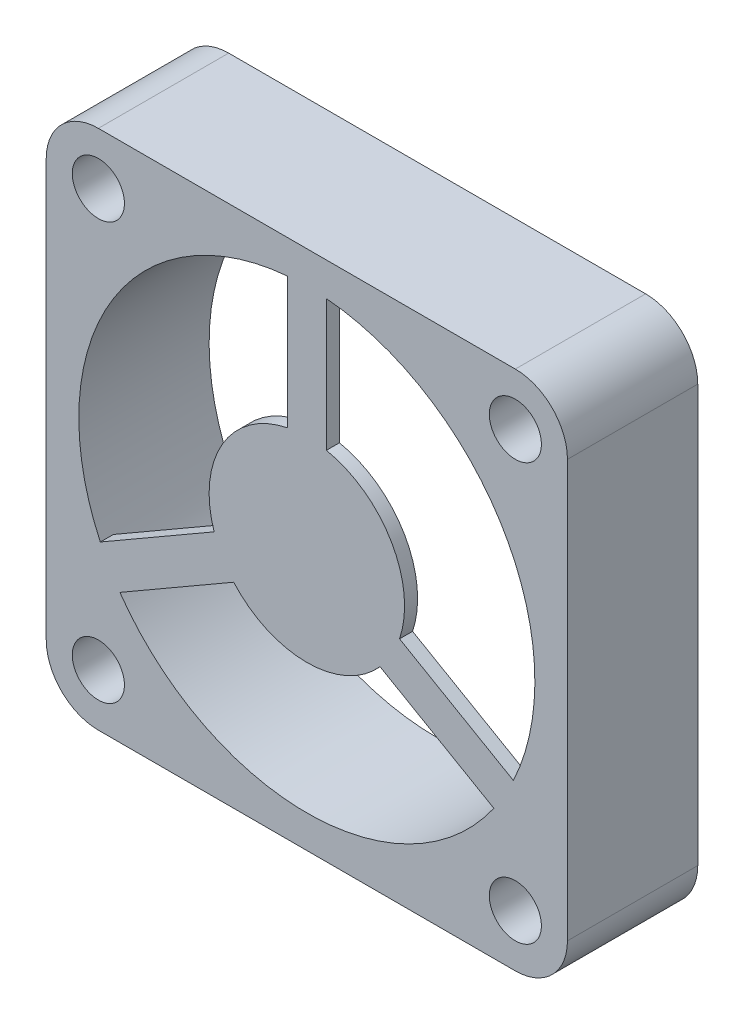
ISO-10303-21;
HEADER;
FILE_DESCRIPTION(('STEP AP214'),'2;1');
FILE_NAME('part.step','',(''),(''),'','','');
FILE_SCHEMA(('AUTOMOTIVE_DESIGN { 1 0 10303 214 1 1 1 1 }'));
ENDSEC;
DATA;
#1=APPLICATION_CONTEXT('core data for automotive mechanical design processes');
#2=APPLICATION_PROTOCOL_DEFINITION('international standard','automotive_design',2000,#1);
#3=PRODUCT_CONTEXT('',#1,'mechanical');
#4=PRODUCT('Part','Part','',(#3));
#5=PRODUCT_RELATED_PRODUCT_CATEGORY('part','',(#4));
#6=PRODUCT_DEFINITION_FORMATION('','',#4);
#7=PRODUCT_DEFINITION_CONTEXT('part definition',#1,'design');
#8=PRODUCT_DEFINITION('design','',#6,#7);
#9=PRODUCT_DEFINITION_SHAPE('','',#8);
#10=(LENGTH_UNIT() NAMED_UNIT(*) SI_UNIT(.MILLI.,.METRE.));
#11=(NAMED_UNIT(*) PLANE_ANGLE_UNIT() SI_UNIT($,.RADIAN.));
#12=(NAMED_UNIT(*) SI_UNIT($,.STERADIAN.) SOLID_ANGLE_UNIT());
#13=UNCERTAINTY_MEASURE_WITH_UNIT(LENGTH_MEASURE(1.E-05),#10,'distance_accuracy_value','');
#14=(GEOMETRIC_REPRESENTATION_CONTEXT(3) GLOBAL_UNCERTAINTY_ASSIGNED_CONTEXT((#13)) GLOBAL_UNIT_ASSIGNED_CONTEXT((#10,
#11,#12)) REPRESENTATION_CONTEXT('',''));
#15=CARTESIAN_POINT('',(0.,0.,0.));
#16=DIRECTION('',(0.,0.,1.));
#17=DIRECTION('',(1.,0.,0.));
#18=AXIS2_PLACEMENT_3D('',#15,#16,#17);
#19=CARTESIAN_POINT('',(-16.,-16.,10.));
#20=DIRECTION('',(0.,0.,-1.));
#21=DIRECTION('',(-1.,0.,0.));
#22=AXIS2_PLACEMENT_3D('',#19,#20,#21);
#23=PLANE('',#22);
#24=CARTESIAN_POINT('',(0.,0.,10.));
#25=DIRECTION('',(0.,0.,1.));
#26=DIRECTION('',(1.,0.,0.));
#27=AXIS2_PLACEMENT_3D('',#24,#25,#26);
#28=CIRCLE('',#27,17.5);
#29=CARTESIAN_POINT('',(-1.5,17.4355957741627,10.));
#30=VERTEX_POINT('',#29);
#31=CARTESIAN_POINT('',(-15.8496688705415,-7.41875978140468,10.));
#32=VERTEX_POINT('',#31);
#33=EDGE_CURVE('E295',#30,#32,#28,.T.);
#34=ORIENTED_EDGE('',*,*,#33,.F.);
#35=DIRECTION('',(0.,-1.,0.));
#36=VECTOR('',#35,1.);
#37=CARTESIAN_POINT('',(-1.5,17.4355957741627,10.));
#38=LINE('',#37,#36);
#39=CARTESIAN_POINT('',(-1.5,7.34846922834953,10.));
#40=VERTEX_POINT('',#39);
#41=EDGE_CURVE('E221',#30,#40,#38,.T.);
#42=ORIENTED_EDGE('',*,*,#41,.T.);
#43=CARTESIAN_POINT('',(0.,0.,10.));
#44=DIRECTION('',(0.,0.,1.));
#45=DIRECTION('',(1.,0.,0.));
#46=AXIS2_PLACEMENT_3D('',#43,#44,#45);
#47=CIRCLE('',#46,7.50000000000002);
#48=CARTESIAN_POINT('',(-7.11396103067895,-2.37519650849812,10.));
#49=VERTEX_POINT('',#48);
#50=EDGE_CURVE('E176',#40,#49,#47,.T.);
#51=ORIENTED_EDGE('',*,*,#50,.T.);
#52=DIRECTION('',(-0.866025403784439,-0.5,0.));
#53=VECTOR('',#52,1.);
#54=CARTESIAN_POINT('',(-7.11396103067897,-2.37519650849813,10.));
#55=LINE('',#54,#53);
#56=EDGE_CURVE('E224',#49,#32,#55,.T.);
#57=ORIENTED_EDGE('',*,*,#56,.T.);
#58=EDGE_LOOP('',(#34,#42,#51,#57));
#59=FACE_BOUND('',#58,.T.);
#60=CARTESIAN_POINT('',(15.8496688705415,-7.41875978140472,10.));
#61=VERTEX_POINT('',#60);
#62=CARTESIAN_POINT('',(1.5,17.4355957741627,10.));
#63=VERTEX_POINT('',#62);
#64=EDGE_CURVE('E292',#61,#63,#28,.T.);
#65=ORIENTED_EDGE('',*,*,#64,.F.);
#66=DIRECTION('',(-0.866025403784439,0.499999999999999,0.));
#67=VECTOR('',#66,1.);
#68=CARTESIAN_POINT('',(15.8496688705415,-7.41875978140473,10.));
#69=LINE('',#68,#67);
#70=CARTESIAN_POINT('',(7.11396103067892,-2.37519650849815,10.));
#71=VERTEX_POINT('',#70);
#72=EDGE_CURVE('E236',#61,#71,#69,.T.);
#73=ORIENTED_EDGE('',*,*,#72,.T.);
#74=CARTESIAN_POINT('',(0.,0.,10.));
#75=DIRECTION('',(0.,0.,1.));
#76=DIRECTION('',(1.,0.,0.));
#77=AXIS2_PLACEMENT_3D('',#74,#75,#76);
#78=CIRCLE('',#77,7.5);
#79=CARTESIAN_POINT('',(1.5,7.34846922834954,10.));
#80=VERTEX_POINT('',#79);
#81=EDGE_CURVE('E239',#71,#80,#78,.T.);
#82=ORIENTED_EDGE('',*,*,#81,.T.);
#83=DIRECTION('',(0.,1.,0.));
#84=VECTOR('',#83,1.);
#85=CARTESIAN_POINT('',(1.5,7.34846922834953,10.));
#86=LINE('',#85,#84);
#87=EDGE_CURVE('E195',#80,#63,#86,.T.);
#88=ORIENTED_EDGE('',*,*,#87,.T.);
#89=EDGE_LOOP('',(#65,#73,#82,#88));
#90=FACE_BOUND('',#89,.T.);
#91=CARTESIAN_POINT('',(-16.,-16.,10.));
#92=DIRECTION('',(0.,0.,1.));
#93=DIRECTION('',(-1.,0.,0.));
#94=AXIS2_PLACEMENT_3D('',#91,#92,#93);
#95=CIRCLE('',#94,4.);
#96=CARTESIAN_POINT('',(-20.,-16.,10.));
#97=VERTEX_POINT('',#96);
#98=CARTESIAN_POINT('',(-16.,-20.,10.));
#99=VERTEX_POINT('',#98);
#100=EDGE_CURVE('E298',#97,#99,#95,.T.);
#101=ORIENTED_EDGE('',*,*,#100,.T.);
#102=DIRECTION('',(1.,0.,0.));
#103=VECTOR('',#102,1.);
#104=CARTESIAN_POINT('',(-16.,-20.,10.));
#105=LINE('',#104,#103);
#106=CARTESIAN_POINT('',(16.,-20.,10.));
#107=VERTEX_POINT('',#106);
#108=EDGE_CURVE('E301',#99,#107,#105,.T.);
#109=ORIENTED_EDGE('',*,*,#108,.T.);
#110=CARTESIAN_POINT('',(16.,-16.,10.));
#111=DIRECTION('',(0.,0.,1.));
#112=DIRECTION('',(1.,0.,0.));
#113=AXIS2_PLACEMENT_3D('',#110,#111,#112);
#114=CIRCLE('',#113,4.);
#115=CARTESIAN_POINT('',(20.,-16.,10.));
#116=VERTEX_POINT('',#115);
#117=EDGE_CURVE('E304',#107,#116,#114,.T.);
#118=ORIENTED_EDGE('',*,*,#117,.T.);
#119=DIRECTION('',(0.,1.,0.));
#120=VECTOR('',#119,1.);
#121=CARTESIAN_POINT('',(20.,-16.,10.));
#122=LINE('',#121,#120);
#123=CARTESIAN_POINT('',(20.,16.,10.));
#124=VERTEX_POINT('',#123);
#125=EDGE_CURVE('E306',#116,#124,#122,.T.);
#126=ORIENTED_EDGE('',*,*,#125,.T.);
#127=CARTESIAN_POINT('',(16.,16.,10.));
#128=DIRECTION('',(0.,0.,1.));
#129=DIRECTION('',(-1.,0.,0.));
#130=AXIS2_PLACEMENT_3D('',#127,#128,#129);
#131=CIRCLE('',#130,4.);
#132=CARTESIAN_POINT('',(16.,20.,10.));
#133=VERTEX_POINT('',#132);
#134=EDGE_CURVE('E308',#124,#133,#131,.T.);
#135=ORIENTED_EDGE('',*,*,#134,.T.);
#136=DIRECTION('',(-1.,0.,0.));
#137=VECTOR('',#136,1.);
#138=CARTESIAN_POINT('',(-16.,20.,10.));
#139=LINE('',#138,#137);
#140=CARTESIAN_POINT('',(-16.,20.,10.));
#141=VERTEX_POINT('',#140);
#142=EDGE_CURVE('E310',#133,#141,#139,.T.);
#143=ORIENTED_EDGE('',*,*,#142,.T.);
#144=CARTESIAN_POINT('',(-16.,16.,10.));
#145=DIRECTION('',(0.,0.,1.));
#146=DIRECTION('',(-1.,0.,0.));
#147=AXIS2_PLACEMENT_3D('',#144,#145,#146);
#148=CIRCLE('',#147,4.);
#149=CARTESIAN_POINT('',(-20.,16.,10.));
#150=VERTEX_POINT('',#149);
#151=EDGE_CURVE('E312',#141,#150,#148,.T.);
#152=ORIENTED_EDGE('',*,*,#151,.T.);
#153=DIRECTION('',(0.,-1.,0.));
#154=VECTOR('',#153,1.);
#155=CARTESIAN_POINT('',(-20.,-16.,10.));
#156=LINE('',#155,#154);
#157=EDGE_CURVE('E314',#150,#97,#156,.T.);
#158=ORIENTED_EDGE('',*,*,#157,.T.);
#159=EDGE_LOOP('',(#101,#109,#118,#126,#135,#143,#152,#158));
#160=FACE_BOUND('',#159,.T.);
#161=DIRECTION('',(0.866025403784439,-0.5,0.));
#162=VECTOR('',#161,1.);
#163=CARTESIAN_POINT('',(5.61396103067892,-4.97327271985147,10.));
#164=LINE('',#163,#162);
#165=CARTESIAN_POINT('',(5.61396103067892,-4.97327271985147,10.));
#166=VERTEX_POINT('',#165);
#167=CARTESIAN_POINT('',(14.3496688705415,-10.016835992758,10.));
#168=VERTEX_POINT('',#167);
#169=EDGE_CURVE('E233',#166,#168,#164,.T.);
#170=ORIENTED_EDGE('',*,*,#169,.T.);
#171=CARTESIAN_POINT('',(-14.3496688705415,-10.016835992758,10.));
#172=VERTEX_POINT('',#171);
#173=EDGE_CURVE('E294',#172,#168,#28,.T.);
#174=ORIENTED_EDGE('',*,*,#173,.F.);
#175=DIRECTION('',(0.866025403784438,0.5,0.));
#176=VECTOR('',#175,1.);
#177=CARTESIAN_POINT('',(-14.3496688705415,-10.016835992758,10.));
#178=LINE('',#177,#176);
#179=CARTESIAN_POINT('',(-5.61396103067897,-4.97327271985144,10.));
#180=VERTEX_POINT('',#179);
#181=EDGE_CURVE('E227',#172,#180,#178,.T.);
#182=ORIENTED_EDGE('',*,*,#181,.T.);
#183=CARTESIAN_POINT('',(0.,0.,10.));
#184=DIRECTION('',(0.,0.,1.));
#185=DIRECTION('',(1.,0.,0.));
#186=AXIS2_PLACEMENT_3D('',#183,#184,#185);
#187=CIRCLE('',#186,7.50000000000003);
#188=EDGE_CURVE('E230',#180,#166,#187,.T.);
#189=ORIENTED_EDGE('',*,*,#188,.T.);
#190=EDGE_LOOP('',(#170,#174,#182,#189));
#191=FACE_BOUND('',#190,.T.);
#192=CARTESIAN_POINT('',(-16.,16.,10.));
#193=DIRECTION('',(0.,0.,1.));
#194=DIRECTION('',(1.,0.,0.));
#195=AXIS2_PLACEMENT_3D('',#192,#193,#194);
#196=CIRCLE('',#195,2.);
#197=CARTESIAN_POINT('',(-14.,16.,10.));
#198=VERTEX_POINT('',#197);
#199=EDGE_CURVE('E286',#198,#198,#196,.T.);
#200=ORIENTED_EDGE('',*,*,#199,.F.);
#201=EDGE_LOOP('',(#200));
#202=FACE_BOUND('',#201,.T.);
#203=CARTESIAN_POINT('',(16.,16.,10.));
#204=DIRECTION('',(0.,0.,1.));
#205=DIRECTION('',(1.,0.,0.));
#206=AXIS2_PLACEMENT_3D('',#203,#204,#205);
#207=CIRCLE('',#206,2.);
#208=CARTESIAN_POINT('',(18.,16.,10.));
#209=VERTEX_POINT('',#208);
#210=EDGE_CURVE('E280',#209,#209,#207,.T.);
#211=ORIENTED_EDGE('',*,*,#210,.F.);
#212=EDGE_LOOP('',(#211));
#213=FACE_BOUND('',#212,.T.);
#214=CARTESIAN_POINT('',(16.,-16.,10.));
#215=DIRECTION('',(0.,0.,1.));
#216=DIRECTION('',(1.,0.,0.));
#217=AXIS2_PLACEMENT_3D('',#214,#215,#216);
#218=CIRCLE('',#217,2.);
#219=CARTESIAN_POINT('',(18.,-16.,10.));
#220=VERTEX_POINT('',#219);
#221=EDGE_CURVE('E274',#220,#220,#218,.T.);
#222=ORIENTED_EDGE('',*,*,#221,.F.);
#223=EDGE_LOOP('',(#222));
#224=FACE_BOUND('',#223,.T.);
#225=CARTESIAN_POINT('',(-16.,-16.,10.));
#226=DIRECTION('',(0.,0.,1.));
#227=DIRECTION('',(1.,0.,0.));
#228=AXIS2_PLACEMENT_3D('',#225,#226,#227);
#229=CIRCLE('',#228,2.);
#230=CARTESIAN_POINT('',(-14.,-16.,10.));
#231=VERTEX_POINT('',#230);
#232=EDGE_CURVE('E268',#231,#231,#229,.T.);
#233=ORIENTED_EDGE('',*,*,#232,.F.);
#234=EDGE_LOOP('',(#233));
#235=FACE_BOUND('',#234,.T.);
#236=ADVANCED_FACE('F35',(#59,#90,#160,#191,#202,#213,#224,#235),#23,.F.);
#237=CARTESIAN_POINT('',(-16.,-16.,0.));
#238=DIRECTION('',(0.,0.,-1.));
#239=DIRECTION('',(-1.,0.,0.));
#240=AXIS2_PLACEMENT_3D('',#237,#238,#239);
#241=PLANE('',#240);
#242=CARTESIAN_POINT('',(16.,-16.,0.));
#243=DIRECTION('',(0.,0.,1.));
#244=DIRECTION('',(1.,0.,0.));
#245=AXIS2_PLACEMENT_3D('',#242,#243,#244);
#246=CIRCLE('',#245,2.);
#247=CARTESIAN_POINT('',(18.,-16.,0.));
#248=VERTEX_POINT('',#247);
#249=EDGE_CURVE('E271',#248,#248,#246,.T.);
#250=ORIENTED_EDGE('',*,*,#249,.T.);
#251=EDGE_LOOP('',(#250));
#252=FACE_BOUND('',#251,.T.);
#253=CARTESIAN_POINT('',(-16.,16.,0.));
#254=DIRECTION('',(0.,0.,1.));
#255=DIRECTION('',(1.,0.,0.));
#256=AXIS2_PLACEMENT_3D('',#253,#254,#255);
#257=CIRCLE('',#256,2.);
#258=CARTESIAN_POINT('',(-14.,16.,0.));
#259=VERTEX_POINT('',#258);
#260=EDGE_CURVE('E283',#259,#259,#257,.T.);
#261=ORIENTED_EDGE('',*,*,#260,.T.);
#262=EDGE_LOOP('',(#261));
#263=FACE_BOUND('',#262,.T.);
#264=CARTESIAN_POINT('',(-16.,-16.,0.));
#265=DIRECTION('',(0.,0.,1.));
#266=DIRECTION('',(-1.,0.,0.));
#267=AXIS2_PLACEMENT_3D('',#264,#265,#266);
#268=CIRCLE('',#267,4.);
#269=CARTESIAN_POINT('',(-20.,-16.,0.));
#270=VERTEX_POINT('',#269);
#271=CARTESIAN_POINT('',(-16.,-20.,0.));
#272=VERTEX_POINT('',#271);
#273=EDGE_CURVE('E317',#270,#272,#268,.T.);
#274=ORIENTED_EDGE('',*,*,#273,.F.);
#275=DIRECTION('',(0.,-1.,0.));
#276=VECTOR('',#275,1.);
#277=CARTESIAN_POINT('',(-20.,-16.,0.));
#278=LINE('',#277,#276);
#279=CARTESIAN_POINT('',(-20.,16.,0.));
#280=VERTEX_POINT('',#279);
#281=EDGE_CURVE('E302',#280,#270,#278,.T.);
#282=ORIENTED_EDGE('',*,*,#281,.F.);
#283=CARTESIAN_POINT('',(-16.,16.,0.));
#284=DIRECTION('',(0.,0.,1.));
#285=DIRECTION('',(-1.,0.,0.));
#286=AXIS2_PLACEMENT_3D('',#283,#284,#285);
#287=CIRCLE('',#286,4.);
#288=CARTESIAN_POINT('',(-16.,20.,0.));
#289=VERTEX_POINT('',#288);
#290=EDGE_CURVE('E330',#289,#280,#287,.T.);
#291=ORIENTED_EDGE('',*,*,#290,.F.);
#292=DIRECTION('',(-1.,0.,0.));
#293=VECTOR('',#292,1.);
#294=CARTESIAN_POINT('',(-16.,20.,0.));
#295=LINE('',#294,#293);
#296=CARTESIAN_POINT('',(16.,20.,0.));
#297=VERTEX_POINT('',#296);
#298=EDGE_CURVE('E328',#297,#289,#295,.T.);
#299=ORIENTED_EDGE('',*,*,#298,.F.);
#300=CARTESIAN_POINT('',(16.,16.,0.));
#301=DIRECTION('',(0.,0.,1.));
#302=DIRECTION('',(-1.,0.,0.));
#303=AXIS2_PLACEMENT_3D('',#300,#301,#302);
#304=CIRCLE('',#303,4.);
#305=CARTESIAN_POINT('',(20.,16.,0.));
#306=VERTEX_POINT('',#305);
#307=EDGE_CURVE('E326',#306,#297,#304,.T.);
#308=ORIENTED_EDGE('',*,*,#307,.F.);
#309=DIRECTION('',(0.,1.,0.));
#310=VECTOR('',#309,1.);
#311=CARTESIAN_POINT('',(20.,-16.,0.));
#312=LINE('',#311,#310);
#313=CARTESIAN_POINT('',(20.,-16.,0.));
#314=VERTEX_POINT('',#313);
#315=EDGE_CURVE('E324',#314,#306,#312,.T.);
#316=ORIENTED_EDGE('',*,*,#315,.F.);
#317=CARTESIAN_POINT('',(16.,-16.,0.));
#318=DIRECTION('',(0.,0.,1.));
#319=DIRECTION('',(1.,0.,0.));
#320=AXIS2_PLACEMENT_3D('',#317,#318,#319);
#321=CIRCLE('',#320,4.);
#322=CARTESIAN_POINT('',(16.,-20.,0.));
#323=VERTEX_POINT('',#322);
#324=EDGE_CURVE('E322',#323,#314,#321,.T.);
#325=ORIENTED_EDGE('',*,*,#324,.F.);
#326=DIRECTION('',(1.,0.,0.));
#327=VECTOR('',#326,1.);
#328=CARTESIAN_POINT('',(-16.,-20.,0.));
#329=LINE('',#328,#327);
#330=EDGE_CURVE('E320',#272,#323,#329,.T.);
#331=ORIENTED_EDGE('',*,*,#330,.F.);
#332=EDGE_LOOP('',(#274,#282,#291,#299,#308,#316,#325,#331));
#333=FACE_BOUND('',#332,.T.);
#334=CARTESIAN_POINT('',(0.,0.,0.));
#335=DIRECTION('',(0.,0.,1.));
#336=DIRECTION('',(1.,0.,0.));
#337=AXIS2_PLACEMENT_3D('',#334,#335,#336);
#338=CIRCLE('',#337,17.5);
#339=CARTESIAN_POINT('',(17.5,0.,0.));
#340=VERTEX_POINT('',#339);
#341=EDGE_CURVE('E289',#340,#340,#338,.T.);
#342=ORIENTED_EDGE('',*,*,#341,.T.);
#343=EDGE_LOOP('',(#342));
#344=FACE_BOUND('',#343,.T.);
#345=CARTESIAN_POINT('',(16.,16.,0.));
#346=DIRECTION('',(0.,0.,1.));
#347=DIRECTION('',(1.,0.,0.));
#348=AXIS2_PLACEMENT_3D('',#345,#346,#347);
#349=CIRCLE('',#348,2.);
#350=CARTESIAN_POINT('',(18.,16.,0.));
#351=VERTEX_POINT('',#350);
#352=EDGE_CURVE('E277',#351,#351,#349,.T.);
#353=ORIENTED_EDGE('',*,*,#352,.T.);
#354=EDGE_LOOP('',(#353));
#355=FACE_BOUND('',#354,.T.);
#356=CARTESIAN_POINT('',(-16.,-16.,0.));
#357=DIRECTION('',(0.,0.,1.));
#358=DIRECTION('',(1.,0.,0.));
#359=AXIS2_PLACEMENT_3D('',#356,#357,#358);
#360=CIRCLE('',#359,2.);
#361=CARTESIAN_POINT('',(-14.,-16.,0.));
#362=VERTEX_POINT('',#361);
#363=EDGE_CURVE('E245',#362,#362,#360,.T.);
#364=ORIENTED_EDGE('',*,*,#363,.T.);
#365=EDGE_LOOP('',(#364));
#366=FACE_BOUND('',#365,.T.);
#367=ADVANCED_FACE('F360',(#252,#263,#333,#344,#355,#366),#241,.T.);
#368=CARTESIAN_POINT('',(-16.,-16.,10.));
#369=DIRECTION('',(0.,0.,-1.));
#370=DIRECTION('',(-1.,0.,0.));
#371=AXIS2_PLACEMENT_3D('',#368,#369,#370);
#372=CYLINDRICAL_SURFACE('',#371,4.);
#373=ORIENTED_EDGE('',*,*,#273,.T.);
#374=DIRECTION('',(0.,0.,-1.));
#375=VECTOR('',#374,1.);
#376=CARTESIAN_POINT('',(-16.,-20.,10.));
#377=LINE('',#376,#375);
#378=EDGE_CURVE('E11',#99,#272,#377,.T.);
#379=ORIENTED_EDGE('',*,*,#378,.F.);
#380=ORIENTED_EDGE('',*,*,#100,.F.);
#381=DIRECTION('',(0.,0.,-1.));
#382=VECTOR('',#381,1.);
#383=CARTESIAN_POINT('',(-20.,-16.,10.));
#384=LINE('',#383,#382);
#385=EDGE_CURVE('E316',#97,#270,#384,.T.);
#386=ORIENTED_EDGE('',*,*,#385,.T.);
#387=EDGE_LOOP('',(#373,#379,#380,#386));
#388=FACE_BOUND('',#387,.T.);
#389=ADVANCED_FACE('F37',(#388),#372,.T.);
#390=CARTESIAN_POINT('',(-16.,-20.,10.));
#391=DIRECTION('',(0.,1.,0.));
#392=DIRECTION('',(0.,0.,1.));
#393=AXIS2_PLACEMENT_3D('',#390,#391,#392);
#394=PLANE('',#393);
#395=ORIENTED_EDGE('',*,*,#330,.T.);
#396=DIRECTION('',(0.,0.,-1.));
#397=VECTOR('',#396,1.);
#398=CARTESIAN_POINT('',(16.,-20.,10.));
#399=LINE('',#398,#397);
#400=EDGE_CURVE('E43',#107,#323,#399,.T.);
#401=ORIENTED_EDGE('',*,*,#400,.F.);
#402=ORIENTED_EDGE('',*,*,#108,.F.);
#403=ORIENTED_EDGE('',*,*,#378,.T.);
#404=EDGE_LOOP('',(#395,#401,#402,#403));
#405=FACE_BOUND('',#404,.T.);
#406=ADVANCED_FACE('F378',(#405),#394,.F.);
#407=CARTESIAN_POINT('',(16.,-16.,10.));
#408=DIRECTION('',(0.,0.,-1.));
#409=DIRECTION('',(-1.,0.,0.));
#410=AXIS2_PLACEMENT_3D('',#407,#408,#409);
#411=CYLINDRICAL_SURFACE('',#410,4.);
#412=ORIENTED_EDGE('',*,*,#324,.T.);
#413=DIRECTION('',(0.,0.,-1.));
#414=VECTOR('',#413,1.);
#415=CARTESIAN_POINT('',(20.,-16.,10.));
#416=LINE('',#415,#414);
#417=EDGE_CURVE('E347',#116,#314,#416,.T.);
#418=ORIENTED_EDGE('',*,*,#417,.F.);
#419=ORIENTED_EDGE('',*,*,#117,.F.);
#420=ORIENTED_EDGE('',*,*,#400,.T.);
#421=EDGE_LOOP('',(#412,#418,#419,#420));
#422=FACE_BOUND('',#421,.T.);
#423=ADVANCED_FACE('F354',(#422),#411,.T.);
#424=CARTESIAN_POINT('',(20.,-16.,10.));
#425=DIRECTION('',(-1.,0.,0.));
#426=DIRECTION('',(0.,0.,1.));
#427=AXIS2_PLACEMENT_3D('',#424,#425,#426);
#428=PLANE('',#427);
#429=ORIENTED_EDGE('',*,*,#315,.T.);
#430=DIRECTION('',(0.,0.,-1.));
#431=VECTOR('',#430,1.);
#432=CARTESIAN_POINT('',(20.,16.,10.));
#433=LINE('',#432,#431);
#434=EDGE_CURVE('E344',#124,#306,#433,.T.);
#435=ORIENTED_EDGE('',*,*,#434,.F.);
#436=ORIENTED_EDGE('',*,*,#125,.F.);
#437=ORIENTED_EDGE('',*,*,#417,.T.);
#438=EDGE_LOOP('',(#429,#435,#436,#437));
#439=FACE_BOUND('',#438,.T.);
#440=ADVANCED_FACE('F366',(#439),#428,.F.);
#441=CARTESIAN_POINT('',(16.,16.,10.));
#442=DIRECTION('',(0.,0.,-1.));
#443=DIRECTION('',(-1.,0.,0.));
#444=AXIS2_PLACEMENT_3D('',#441,#442,#443);
#445=CYLINDRICAL_SURFACE('',#444,4.);
#446=ORIENTED_EDGE('',*,*,#307,.T.);
#447=DIRECTION('',(0.,0.,-1.));
#448=VECTOR('',#447,1.);
#449=CARTESIAN_POINT('',(16.,20.,10.));
#450=LINE('',#449,#448);
#451=EDGE_CURVE('E341',#133,#297,#450,.T.);
#452=ORIENTED_EDGE('',*,*,#451,.F.);
#453=ORIENTED_EDGE('',*,*,#134,.F.);
#454=ORIENTED_EDGE('',*,*,#434,.T.);
#455=EDGE_LOOP('',(#446,#452,#453,#454));
#456=FACE_BOUND('',#455,.T.);
#457=ADVANCED_FACE('F370',(#456),#445,.T.);
#458=CARTESIAN_POINT('',(-16.,20.,10.));
#459=DIRECTION('',(0.,-1.,0.));
#460=DIRECTION('',(0.,0.,-1.));
#461=AXIS2_PLACEMENT_3D('',#458,#459,#460);
#462=PLANE('',#461);
#463=ORIENTED_EDGE('',*,*,#298,.T.);
#464=DIRECTION('',(0.,0.,-1.));
#465=VECTOR('',#464,1.);
#466=CARTESIAN_POINT('',(-16.,20.,10.));
#467=LINE('',#466,#465);
#468=EDGE_CURVE('E338',#141,#289,#467,.T.);
#469=ORIENTED_EDGE('',*,*,#468,.F.);
#470=ORIENTED_EDGE('',*,*,#142,.F.);
#471=ORIENTED_EDGE('',*,*,#451,.T.);
#472=EDGE_LOOP('',(#463,#469,#470,#471));
#473=FACE_BOUND('',#472,.T.);
#474=ADVANCED_FACE('F391',(#473),#462,.F.);
#475=CARTESIAN_POINT('',(-16.,16.,10.));
#476=DIRECTION('',(0.,0.,-1.));
#477=DIRECTION('',(-1.,0.,0.));
#478=AXIS2_PLACEMENT_3D('',#475,#476,#477);
#479=CYLINDRICAL_SURFACE('',#478,4.);
#480=ORIENTED_EDGE('',*,*,#290,.T.);
#481=DIRECTION('',(0.,0.,-1.));
#482=VECTOR('',#481,1.);
#483=CARTESIAN_POINT('',(-20.,16.,10.));
#484=LINE('',#483,#482);
#485=EDGE_CURVE('E335',#150,#280,#484,.T.);
#486=ORIENTED_EDGE('',*,*,#485,.F.);
#487=ORIENTED_EDGE('',*,*,#151,.F.);
#488=ORIENTED_EDGE('',*,*,#468,.T.);
#489=EDGE_LOOP('',(#480,#486,#487,#488));
#490=FACE_BOUND('',#489,.T.);
#491=ADVANCED_FACE('F389',(#490),#479,.T.);
#492=CARTESIAN_POINT('',(-20.,-16.,10.));
#493=DIRECTION('',(1.,0.,0.));
#494=DIRECTION('',(0.,0.,-1.));
#495=AXIS2_PLACEMENT_3D('',#492,#493,#494);
#496=PLANE('',#495);
#497=ORIENTED_EDGE('',*,*,#281,.T.);
#498=ORIENTED_EDGE('',*,*,#385,.F.);
#499=ORIENTED_EDGE('',*,*,#157,.F.);
#500=ORIENTED_EDGE('',*,*,#485,.T.);
#501=EDGE_LOOP('',(#497,#498,#499,#500));
#502=FACE_BOUND('',#501,.T.);
#503=ADVANCED_FACE('F384',(#502),#496,.F.);
#504=CARTESIAN_POINT('',(0.,0.,10.));
#505=DIRECTION('',(0.,0.,-1.));
#506=DIRECTION('',(-1.,0.,0.));
#507=AXIS2_PLACEMENT_3D('',#504,#505,#506);
#508=CYLINDRICAL_SURFACE('',#507,17.5);
#509=DIRECTION('',(0.,0.,1.));
#510=VECTOR('',#509,1.);
#511=CARTESIAN_POINT('',(1.5,17.4355957741627,9.));
#512=LINE('',#511,#510);
#513=CARTESIAN_POINT('',(1.5,17.4355957741627,9.));
#514=VERTEX_POINT('',#513);
#515=EDGE_CURVE('E50',#514,#63,#512,.T.);
#516=ORIENTED_EDGE('',*,*,#515,.F.);
#517=CARTESIAN_POINT('',(0.,0.,9.));
#518=DIRECTION('',(0.,0.,1.));
#519=DIRECTION('',(-1.,0.,0.));
#520=AXIS2_PLACEMENT_3D('',#517,#518,#519);
#521=CIRCLE('',#520,17.5);
#522=CARTESIAN_POINT('',(-1.5,17.4355957741627,9.));
#523=VERTEX_POINT('',#522);
#524=EDGE_CURVE('E54',#514,#523,#521,.T.);
#525=ORIENTED_EDGE('',*,*,#524,.T.);
#526=DIRECTION('',(0.,0.,1.));
#527=VECTOR('',#526,1.);
#528=CARTESIAN_POINT('',(-1.5,17.4355957741627,9.));
#529=LINE('',#528,#527);
#530=EDGE_CURVE('E182',#523,#30,#529,.T.);
#531=ORIENTED_EDGE('',*,*,#530,.T.);
#532=ORIENTED_EDGE('',*,*,#33,.T.);
#533=DIRECTION('',(0.,0.,1.));
#534=VECTOR('',#533,1.);
#535=CARTESIAN_POINT('',(-15.8496688705415,-7.41875978140471,9.));
#536=LINE('',#535,#534);
#537=CARTESIAN_POINT('',(-15.8496688705415,-7.41875978140469,9.));
#538=VERTEX_POINT('',#537);
#539=EDGE_CURVE('E263',#538,#32,#536,.T.);
#540=ORIENTED_EDGE('',*,*,#539,.F.);
#541=CARTESIAN_POINT('',(0.,0.,9.));
#542=DIRECTION('',(0.,0.,1.));
#543=DIRECTION('',(-1.,0.,0.));
#544=AXIS2_PLACEMENT_3D('',#541,#542,#543);
#545=CIRCLE('',#544,17.5000000000001);
#546=CARTESIAN_POINT('',(-14.3496688705415,-10.016835992758,9.));
#547=VERTEX_POINT('',#546);
#548=EDGE_CURVE('E199',#538,#547,#545,.T.);
#549=ORIENTED_EDGE('',*,*,#548,.T.);
#550=DIRECTION('',(0.,0.,1.));
#551=VECTOR('',#550,1.);
#552=CARTESIAN_POINT('',(-14.3496688705415,-10.016835992758,9.));
#553=LINE('',#552,#551);
#554=EDGE_CURVE('E260',#547,#172,#553,.T.);
#555=ORIENTED_EDGE('',*,*,#554,.T.);
#556=ORIENTED_EDGE('',*,*,#173,.T.);
#557=DIRECTION('',(0.,0.,1.));
#558=VECTOR('',#557,1.);
#559=CARTESIAN_POINT('',(14.3496688705415,-10.016835992758,9.));
#560=LINE('',#559,#558);
#561=CARTESIAN_POINT('',(14.3496688705415,-10.016835992758,9.));
#562=VERTEX_POINT('',#561);
#563=EDGE_CURVE('E253',#562,#168,#560,.T.);
#564=ORIENTED_EDGE('',*,*,#563,.F.);
#565=CARTESIAN_POINT('',(0.,0.,9.));
#566=DIRECTION('',(0.,0.,1.));
#567=DIRECTION('',(1.,0.,0.));
#568=AXIS2_PLACEMENT_3D('',#565,#566,#567);
#569=CIRCLE('',#568,17.5);
#570=CARTESIAN_POINT('',(15.8496688705415,-7.41875978140472,9.));
#571=VERTEX_POINT('',#570);
#572=EDGE_CURVE('E210',#562,#571,#569,.T.);
#573=ORIENTED_EDGE('',*,*,#572,.T.);
#574=DIRECTION('',(0.,0.,1.));
#575=VECTOR('',#574,1.);
#576=CARTESIAN_POINT('',(15.8496688705415,-7.41875978140472,9.));
#577=LINE('',#576,#575);
#578=EDGE_CURVE('E250',#571,#61,#577,.T.);
#579=ORIENTED_EDGE('',*,*,#578,.T.);
#580=ORIENTED_EDGE('',*,*,#64,.T.);
#581=EDGE_LOOP('',(#516,#525,#531,#532,#540,#549,#555,#556,#564,#573,#579,#580));
#582=FACE_BOUND('',#581,.T.);
#583=ORIENTED_EDGE('',*,*,#341,.F.);
#584=EDGE_LOOP('',(#583));
#585=FACE_BOUND('',#584,.T.);
#586=ADVANCED_FACE('F410',(#582,#585),#508,.F.);
#587=CARTESIAN_POINT('',(-16.,16.,10.));
#588=DIRECTION('',(0.,0.,-1.));
#589=DIRECTION('',(-1.,0.,0.));
#590=AXIS2_PLACEMENT_3D('',#587,#588,#589);
#591=CYLINDRICAL_SURFACE('',#590,2.);
#592=ORIENTED_EDGE('',*,*,#199,.T.);
#593=EDGE_LOOP('',(#592));
#594=FACE_BOUND('',#593,.T.);
#595=ORIENTED_EDGE('',*,*,#260,.F.);
#596=EDGE_LOOP('',(#595));
#597=FACE_BOUND('',#596,.T.);
#598=ADVANCED_FACE('F417',(#594,#597),#591,.F.);
#599=CARTESIAN_POINT('',(16.,16.,10.));
#600=DIRECTION('',(0.,0.,-1.));
#601=DIRECTION('',(-1.,0.,0.));
#602=AXIS2_PLACEMENT_3D('',#599,#600,#601);
#603=CYLINDRICAL_SURFACE('',#602,2.);
#604=ORIENTED_EDGE('',*,*,#210,.T.);
#605=EDGE_LOOP('',(#604));
#606=FACE_BOUND('',#605,.T.);
#607=ORIENTED_EDGE('',*,*,#352,.F.);
#608=EDGE_LOOP('',(#607));
#609=FACE_BOUND('',#608,.T.);
#610=ADVANCED_FACE('F421',(#606,#609),#603,.F.);
#611=CARTESIAN_POINT('',(16.,-16.,10.));
#612=DIRECTION('',(0.,0.,-1.));
#613=DIRECTION('',(-1.,0.,0.));
#614=AXIS2_PLACEMENT_3D('',#611,#612,#613);
#615=CYLINDRICAL_SURFACE('',#614,2.);
#616=ORIENTED_EDGE('',*,*,#221,.T.);
#617=EDGE_LOOP('',(#616));
#618=FACE_BOUND('',#617,.T.);
#619=ORIENTED_EDGE('',*,*,#249,.F.);
#620=EDGE_LOOP('',(#619));
#621=FACE_BOUND('',#620,.T.);
#622=ADVANCED_FACE('F433',(#618,#621),#615,.F.);
#623=CARTESIAN_POINT('',(-16.,-16.,10.));
#624=DIRECTION('',(0.,0.,-1.));
#625=DIRECTION('',(-1.,0.,0.));
#626=AXIS2_PLACEMENT_3D('',#623,#624,#625);
#627=CYLINDRICAL_SURFACE('',#626,2.);
#628=ORIENTED_EDGE('',*,*,#232,.T.);
#629=EDGE_LOOP('',(#628));
#630=FACE_BOUND('',#629,.T.);
#631=ORIENTED_EDGE('',*,*,#363,.F.);
#632=EDGE_LOOP('',(#631));
#633=FACE_BOUND('',#632,.T.);
#634=ADVANCED_FACE('F430',(#630,#633),#627,.F.);
#635=CARTESIAN_POINT('',(1.5,7.34846922834953,9.));
#636=DIRECTION('',(1.,0.,0.));
#637=DIRECTION('',(0.,0.,-1.));
#638=AXIS2_PLACEMENT_3D('',#635,#636,#637);
#639=PLANE('',#638);
#640=ORIENTED_EDGE('',*,*,#87,.F.);
#641=DIRECTION('',(0.,0.,1.));
#642=VECTOR('',#641,1.);
#643=CARTESIAN_POINT('',(1.5,7.34846922834954,9.));
#644=LINE('',#643,#642);
#645=CARTESIAN_POINT('',(1.5,7.34846922834954,9.));
#646=VERTEX_POINT('',#645);
#647=EDGE_CURVE('E246',#646,#80,#644,.T.);
#648=ORIENTED_EDGE('',*,*,#647,.F.);
#649=DIRECTION('',(0.,1.,0.));
#650=VECTOR('',#649,1.);
#651=CARTESIAN_POINT('',(1.5,7.34846922834953,9.));
#652=LINE('',#651,#650);
#653=EDGE_CURVE('E218',#646,#514,#652,.T.);
#654=ORIENTED_EDGE('',*,*,#653,.T.);
#655=ORIENTED_EDGE('',*,*,#515,.T.);
#656=EDGE_LOOP('',(#640,#648,#654,#655));
#657=FACE_BOUND('',#656,.T.);
#658=ADVANCED_FACE('F432',(#657),#639,.T.);
#659=CARTESIAN_POINT('',(0.,0.,9.));
#660=DIRECTION('',(0.,0.,1.));
#661=DIRECTION('',(1.,0.,0.));
#662=AXIS2_PLACEMENT_3D('',#659,#660,#661);
#663=CYLINDRICAL_SURFACE('',#662,7.5);
#664=ORIENTED_EDGE('',*,*,#81,.F.);
#665=DIRECTION('',(0.,0.,1.));
#666=VECTOR('',#665,1.);
#667=CARTESIAN_POINT('',(7.11396103067892,-2.37519650849815,9.));
#668=LINE('',#667,#666);
#669=CARTESIAN_POINT('',(7.11396103067892,-2.37519650849815,9.));
#670=VERTEX_POINT('',#669);
#671=EDGE_CURVE('E248',#670,#71,#668,.T.);
#672=ORIENTED_EDGE('',*,*,#671,.F.);
#673=CARTESIAN_POINT('',(0.,0.,9.));
#674=DIRECTION('',(0.,0.,1.));
#675=DIRECTION('',(1.,0.,0.));
#676=AXIS2_PLACEMENT_3D('',#673,#674,#675);
#677=CIRCLE('',#676,7.5);
#678=EDGE_CURVE('E215',#670,#646,#677,.T.);
#679=ORIENTED_EDGE('',*,*,#678,.T.);
#680=ORIENTED_EDGE('',*,*,#647,.T.);
#681=EDGE_LOOP('',(#664,#672,#679,#680));
#682=FACE_BOUND('',#681,.T.);
#683=ADVANCED_FACE('F440',(#682),#663,.T.);
#684=CARTESIAN_POINT('',(15.8496688705415,-7.41875978140473,9.));
#685=DIRECTION('',(0.499999999999999,0.866025403784439,0.));
#686=DIRECTION('',(-0.866025403784439,0.499999999999999,0.));
#687=AXIS2_PLACEMENT_3D('',#684,#685,#686);
#688=PLANE('',#687);
#689=ORIENTED_EDGE('',*,*,#72,.F.);
#690=ORIENTED_EDGE('',*,*,#578,.F.);
#691=DIRECTION('',(-0.866025403784439,0.499999999999999,0.));
#692=VECTOR('',#691,1.);
#693=CARTESIAN_POINT('',(15.8496688705415,-7.41875978140473,9.));
#694=LINE('',#693,#692);
#695=EDGE_CURVE('E212',#571,#670,#694,.T.);
#696=ORIENTED_EDGE('',*,*,#695,.T.);
#697=ORIENTED_EDGE('',*,*,#671,.T.);
#698=EDGE_LOOP('',(#689,#690,#696,#697));
#699=FACE_BOUND('',#698,.T.);
#700=ADVANCED_FACE('F500',(#699),#688,.T.);
#701=CARTESIAN_POINT('',(5.61396103067892,-4.97327271985147,9.));
#702=DIRECTION('',(-0.5,-0.866025403784439,0.));
#703=DIRECTION('',(0.866025403784439,-0.5,0.));
#704=AXIS2_PLACEMENT_3D('',#701,#702,#703);
#705=PLANE('',#704);
#706=ORIENTED_EDGE('',*,*,#169,.F.);
#707=DIRECTION('',(0.,0.,1.));
#708=VECTOR('',#707,1.);
#709=CARTESIAN_POINT('',(5.61396103067892,-4.97327271985147,9.));
#710=LINE('',#709,#708);
#711=CARTESIAN_POINT('',(5.61396103067892,-4.97327271985147,9.));
#712=VERTEX_POINT('',#711);
#713=EDGE_CURVE('E256',#712,#166,#710,.T.);
#714=ORIENTED_EDGE('',*,*,#713,.F.);
#715=DIRECTION('',(0.866025403784439,-0.5,0.));
#716=VECTOR('',#715,1.);
#717=CARTESIAN_POINT('',(5.61396103067892,-4.97327271985147,9.));
#718=LINE('',#717,#716);
#719=EDGE_CURVE('E207',#712,#562,#718,.T.);
#720=ORIENTED_EDGE('',*,*,#719,.T.);
#721=ORIENTED_EDGE('',*,*,#563,.T.);
#722=EDGE_LOOP('',(#706,#714,#720,#721));
#723=FACE_BOUND('',#722,.T.);
#724=ADVANCED_FACE('F510',(#723),#705,.T.);
#725=CARTESIAN_POINT('',(0.,0.,9.));
#726=DIRECTION('',(0.,0.,1.));
#727=DIRECTION('',(1.,0.,0.));
#728=AXIS2_PLACEMENT_3D('',#725,#726,#727);
#729=CYLINDRICAL_SURFACE('',#728,7.50000000000003);
#730=ORIENTED_EDGE('',*,*,#188,.F.);
#731=DIRECTION('',(0.,0.,1.));
#732=VECTOR('',#731,1.);
#733=CARTESIAN_POINT('',(-5.61396103067897,-4.97327271985144,9.));
#734=LINE('',#733,#732);
#735=CARTESIAN_POINT('',(-5.61396103067897,-4.97327271985144,9.));
#736=VERTEX_POINT('',#735);
#737=EDGE_CURVE('E258',#736,#180,#734,.T.);
#738=ORIENTED_EDGE('',*,*,#737,.F.);
#739=CARTESIAN_POINT('',(0.,0.,9.));
#740=DIRECTION('',(0.,0.,1.));
#741=DIRECTION('',(1.,0.,0.));
#742=AXIS2_PLACEMENT_3D('',#739,#740,#741);
#743=CIRCLE('',#742,7.50000000000003);
#744=EDGE_CURVE('E204',#736,#712,#743,.T.);
#745=ORIENTED_EDGE('',*,*,#744,.T.);
#746=ORIENTED_EDGE('',*,*,#713,.T.);
#747=EDGE_LOOP('',(#730,#738,#745,#746));
#748=FACE_BOUND('',#747,.T.);
#749=ADVANCED_FACE('F520',(#748),#729,.T.);
#750=CARTESIAN_POINT('',(-14.3496688705415,-10.016835992758,9.));
#751=DIRECTION('',(0.5,-0.866025403784438,0.));
#752=DIRECTION('',(0.866025403784438,0.5,0.));
#753=AXIS2_PLACEMENT_3D('',#750,#751,#752);
#754=PLANE('',#753);
#755=ORIENTED_EDGE('',*,*,#181,.F.);
#756=ORIENTED_EDGE('',*,*,#554,.F.);
#757=DIRECTION('',(0.866025403784438,0.5,0.));
#758=VECTOR('',#757,1.);
#759=CARTESIAN_POINT('',(-14.3496688705415,-10.016835992758,9.));
#760=LINE('',#759,#758);
#761=EDGE_CURVE('E201',#547,#736,#760,.T.);
#762=ORIENTED_EDGE('',*,*,#761,.T.);
#763=ORIENTED_EDGE('',*,*,#737,.T.);
#764=EDGE_LOOP('',(#755,#756,#762,#763));
#765=FACE_BOUND('',#764,.T.);
#766=ADVANCED_FACE('F530',(#765),#754,.T.);
#767=CARTESIAN_POINT('',(-7.11396103067897,-2.37519650849813,9.));
#768=DIRECTION('',(-0.5,0.866025403784439,0.));
#769=DIRECTION('',(-0.866025403784439,-0.5,0.));
#770=AXIS2_PLACEMENT_3D('',#767,#768,#769);
#771=PLANE('',#770);
#772=ORIENTED_EDGE('',*,*,#56,.F.);
#773=DIRECTION('',(0.,0.,1.));
#774=VECTOR('',#773,1.);
#775=CARTESIAN_POINT('',(-7.11396103067895,-2.37519650849812,9.));
#776=LINE('',#775,#774);
#777=CARTESIAN_POINT('',(-7.11396103067895,-2.37519650849812,9.));
#778=VERTEX_POINT('',#777);
#779=EDGE_CURVE('E181',#778,#49,#776,.T.);
#780=ORIENTED_EDGE('',*,*,#779,.F.);
#781=DIRECTION('',(-0.866025403784439,-0.5,0.));
#782=VECTOR('',#781,1.);
#783=CARTESIAN_POINT('',(-7.11396103067897,-2.37519650849813,9.));
#784=LINE('',#783,#782);
#785=EDGE_CURVE('E191',#778,#538,#784,.T.);
#786=ORIENTED_EDGE('',*,*,#785,.T.);
#787=ORIENTED_EDGE('',*,*,#539,.T.);
#788=EDGE_LOOP('',(#772,#780,#786,#787));
#789=FACE_BOUND('',#788,.T.);
#790=ADVANCED_FACE('F540',(#789),#771,.T.);
#791=CARTESIAN_POINT('',(0.,0.,9.));
#792=DIRECTION('',(0.,0.,1.));
#793=DIRECTION('',(1.,0.,0.));
#794=AXIS2_PLACEMENT_3D('',#791,#792,#793);
#795=CYLINDRICAL_SURFACE('',#794,7.50000000000002);
#796=ORIENTED_EDGE('',*,*,#50,.F.);
#797=DIRECTION('',(0.,0.,1.));
#798=VECTOR('',#797,1.);
#799=CARTESIAN_POINT('',(-1.5,7.34846922834953,9.));
#800=LINE('',#799,#798);
#801=CARTESIAN_POINT('',(-1.5,7.34846922834953,9.));
#802=VERTEX_POINT('',#801);
#803=EDGE_CURVE('E171',#802,#40,#800,.T.);
#804=ORIENTED_EDGE('',*,*,#803,.F.);
#805=CARTESIAN_POINT('',(0.,0.,9.));
#806=DIRECTION('',(0.,0.,1.));
#807=DIRECTION('',(1.,0.,0.));
#808=AXIS2_PLACEMENT_3D('',#805,#806,#807);
#809=CIRCLE('',#808,7.50000000000002);
#810=EDGE_CURVE('E174',#802,#778,#809,.T.);
#811=ORIENTED_EDGE('',*,*,#810,.T.);
#812=ORIENTED_EDGE('',*,*,#779,.T.);
#813=EDGE_LOOP('',(#796,#804,#811,#812));
#814=FACE_BOUND('',#813,.T.);
#815=ADVANCED_FACE('F173',(#814),#795,.T.);
#816=CARTESIAN_POINT('',(-1.5,17.4355957741627,9.));
#817=DIRECTION('',(-1.,0.,0.));
#818=DIRECTION('',(0.,-1.,0.));
#819=AXIS2_PLACEMENT_3D('',#816,#817,#818);
#820=PLANE('',#819);
#821=ORIENTED_EDGE('',*,*,#41,.F.);
#822=ORIENTED_EDGE('',*,*,#530,.F.);
#823=DIRECTION('',(0.,-1.,0.));
#824=VECTOR('',#823,1.);
#825=CARTESIAN_POINT('',(-1.5,17.4355957741627,9.));
#826=LINE('',#825,#824);
#827=EDGE_CURVE('E188',#523,#802,#826,.T.);
#828=ORIENTED_EDGE('',*,*,#827,.T.);
#829=ORIENTED_EDGE('',*,*,#803,.T.);
#830=EDGE_LOOP('',(#821,#822,#828,#829));
#831=FACE_BOUND('',#830,.T.);
#832=ADVANCED_FACE('F193',(#831),#820,.T.);
#833=CARTESIAN_POINT('',(0.,0.,9.));
#834=DIRECTION('',(0.,0.,-1.));
#835=DIRECTION('',(-1.,0.,0.));
#836=AXIS2_PLACEMENT_3D('',#833,#834,#835);
#837=PLANE('',#836);
#838=ORIENTED_EDGE('',*,*,#524,.F.);
#839=ORIENTED_EDGE('',*,*,#653,.F.);
#840=ORIENTED_EDGE('',*,*,#678,.F.);
#841=ORIENTED_EDGE('',*,*,#695,.F.);
#842=ORIENTED_EDGE('',*,*,#572,.F.);
#843=ORIENTED_EDGE('',*,*,#719,.F.);
#844=ORIENTED_EDGE('',*,*,#744,.F.);
#845=ORIENTED_EDGE('',*,*,#761,.F.);
#846=ORIENTED_EDGE('',*,*,#548,.F.);
#847=ORIENTED_EDGE('',*,*,#785,.F.);
#848=ORIENTED_EDGE('',*,*,#810,.F.);
#849=ORIENTED_EDGE('',*,*,#827,.F.);
#850=EDGE_LOOP('',(#838,#839,#840,#841,#842,#843,#844,#845,#846,#847,#848,#849));
#851=FACE_BOUND('',#850,.T.);
#852=ADVANCED_FACE('F187',(#851),#837,.T.);
#853=CLOSED_SHELL('',(#236,#367,#389,#406,#423,#440,#457,#474,#491,#503,#586,#598,#610,#622,
#634,#658,#683,#700,#724,#749,#766,#790,#815,#832,#852));
#854=MANIFOLD_SOLID_BREP('B2',#853);
#855=ADVANCED_BREP_SHAPE_REPRESENTATION('',(#18,#854),#14);
#856=SHAPE_DEFINITION_REPRESENTATION(#9,#855);
ENDSEC;
END-ISO-10303-21;
